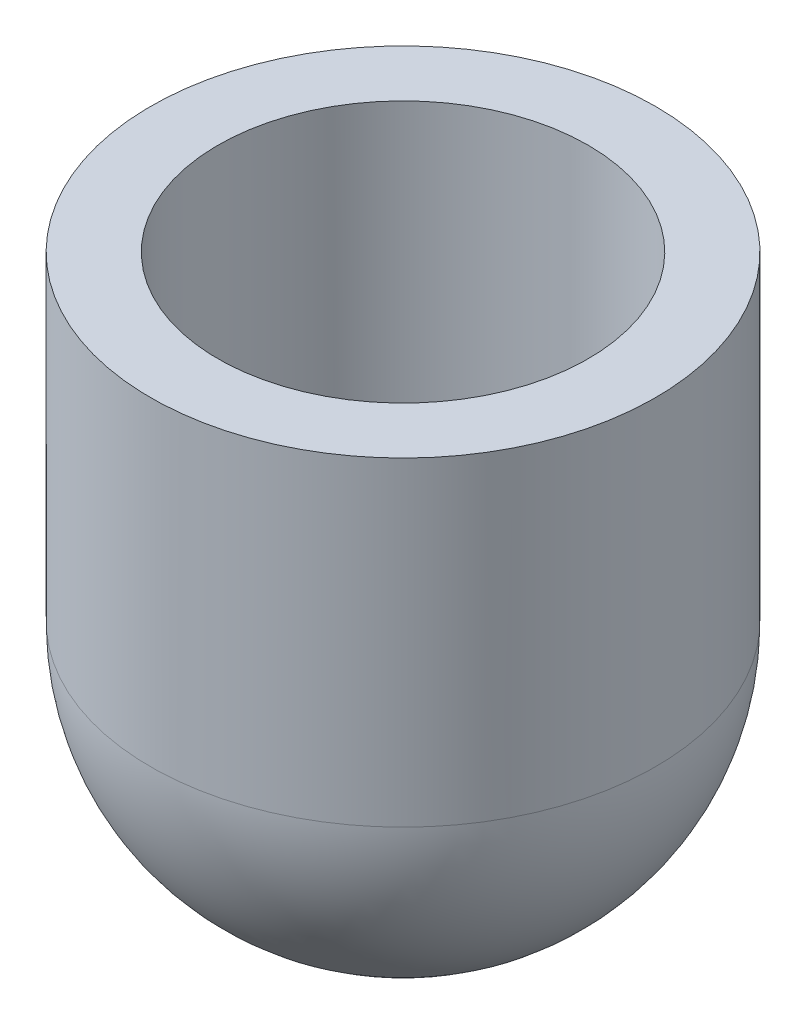
ISO-10303-21;
HEADER;
FILE_DESCRIPTION(('STEP AP214'),'2;1');
FILE_NAME('part.step','',(''),(''),'','','');
FILE_SCHEMA(('AUTOMOTIVE_DESIGN { 1 0 10303 214 1 1 1 1 }'));
ENDSEC;
DATA;
#1=APPLICATION_CONTEXT('core data for automotive mechanical design processes');
#2=APPLICATION_PROTOCOL_DEFINITION('international standard','automotive_design',2000,#1);
#3=PRODUCT_CONTEXT('',#1,'mechanical');
#4=PRODUCT('Part','Part','',(#3));
#5=PRODUCT_RELATED_PRODUCT_CATEGORY('part','',(#4));
#6=PRODUCT_DEFINITION_FORMATION('','',#4);
#7=PRODUCT_DEFINITION_CONTEXT('part definition',#1,'design');
#8=PRODUCT_DEFINITION('design','',#6,#7);
#9=PRODUCT_DEFINITION_SHAPE('','',#8);
#10=(LENGTH_UNIT() NAMED_UNIT(*) SI_UNIT(.MILLI.,.METRE.));
#11=(NAMED_UNIT(*) PLANE_ANGLE_UNIT() SI_UNIT($,.RADIAN.));
#12=(NAMED_UNIT(*) SI_UNIT($,.STERADIAN.) SOLID_ANGLE_UNIT());
#13=UNCERTAINTY_MEASURE_WITH_UNIT(LENGTH_MEASURE(1.E-05),#10,'distance_accuracy_value','');
#14=(GEOMETRIC_REPRESENTATION_CONTEXT(3) GLOBAL_UNCERTAINTY_ASSIGNED_CONTEXT((#13)) GLOBAL_UNIT_ASSIGNED_CONTEXT((#10,
#11,#12)) REPRESENTATION_CONTEXT('',''));
#15=CARTESIAN_POINT('',(0.,0.,0.));
#16=DIRECTION('',(0.,0.,1.));
#17=DIRECTION('',(1.,0.,0.));
#18=AXIS2_PLACEMENT_3D('',#15,#16,#17);
#19=CARTESIAN_POINT('',(-7.5,0.,0.));
#20=DIRECTION('',(0.,-1.,0.));
#21=DIRECTION('',(0.,0.,-1.));
#22=AXIS2_PLACEMENT_3D('',#19,#20,#21);
#23=PLANE('',#22);
#24=CARTESIAN_POINT('',(0.,0.,0.));
#25=DIRECTION('',(0.,-1.,0.));
#26=DIRECTION('',(0.,0.,-1.));
#27=AXIS2_PLACEMENT_3D('',#24,#25,#26);
#28=CIRCLE('',#27,7.5);
#29=CARTESIAN_POINT('',(0.,0.,-7.5));
#30=VERTEX_POINT('',#29);
#31=EDGE_CURVE('E10',#30,#30,#28,.T.);
#32=ORIENTED_EDGE('',*,*,#31,.F.);
#33=EDGE_LOOP('',(#32));
#34=FACE_BOUND('',#33,.T.);
#35=CARTESIAN_POINT('',(0.,0.,0.));
#36=DIRECTION('',(0.,-1.,0.));
#37=DIRECTION('',(0.,0.,-1.));
#38=AXIS2_PLACEMENT_3D('',#35,#36,#37);
#39=CIRCLE('',#38,5.5);
#40=CARTESIAN_POINT('',(0.,0.,-5.5));
#41=VERTEX_POINT('',#40);
#42=EDGE_CURVE('E51',#41,#41,#39,.T.);
#43=ORIENTED_EDGE('',*,*,#42,.T.);
#44=EDGE_LOOP('',(#43));
#45=FACE_BOUND('',#44,.T.);
#46=ADVANCED_FACE('F37',(#34,#45),#23,.F.);
#47=CARTESIAN_POINT('',(0.,-17.,0.));
#48=DIRECTION('',(0.,-1.,0.));
#49=DIRECTION('',(0.,0.,-1.));
#50=AXIS2_PLACEMENT_3D('',#47,#48,#49);
#51=CYLINDRICAL_SURFACE('',#50,7.5);
#52=CARTESIAN_POINT('',(0.,-9.5,0.));
#53=DIRECTION('',(0.,-1.,0.));
#54=DIRECTION('',(0.,0.,-1.));
#55=AXIS2_PLACEMENT_3D('',#52,#53,#54);
#56=CIRCLE('',#55,7.5);
#57=CARTESIAN_POINT('',(0.,-9.5,-7.5));
#58=VERTEX_POINT('',#57);
#59=EDGE_CURVE('E43',#58,#58,#56,.T.);
#60=ORIENTED_EDGE('',*,*,#59,.F.);
#61=EDGE_LOOP('',(#60));
#62=FACE_BOUND('',#61,.T.);
#63=ORIENTED_EDGE('',*,*,#31,.T.);
#64=EDGE_LOOP('',(#63));
#65=FACE_BOUND('',#64,.T.);
#66=ADVANCED_FACE('F71',(#62,#65),#51,.T.);
#67=CARTESIAN_POINT('',(0.,-9.5,0.));
#68=DIRECTION('',(0.,-1.,0.));
#69=DIRECTION('',(-1.,0.,0.));
#70=AXIS2_PLACEMENT_3D('',#67,#68,#69);
#71=SPHERICAL_SURFACE('',#70,7.5);
#72=ORIENTED_EDGE('',*,*,#59,.T.);
#73=EDGE_LOOP('',(#72));
#74=FACE_BOUND('',#73,.T.);
#75=ADVANCED_FACE('F66',(#74),#71,.T.);
#76=CARTESIAN_POINT('',(0.,-9.5,0.));
#77=DIRECTION('',(0.,-1.,0.));
#78=DIRECTION('',(-1.,0.,0.));
#79=AXIS2_PLACEMENT_3D('',#76,#77,#78);
#80=SPHERICAL_SURFACE('',#79,5.5);
#81=CARTESIAN_POINT('',(0.,-9.5,0.));
#82=DIRECTION('',(0.,-1.,0.));
#83=DIRECTION('',(0.,0.,-1.));
#84=AXIS2_PLACEMENT_3D('',#81,#82,#83);
#85=CIRCLE('',#84,5.5);
#86=CARTESIAN_POINT('',(0.,-9.5,-5.5));
#87=VERTEX_POINT('',#86);
#88=EDGE_CURVE('E47',#87,#87,#85,.T.);
#89=ORIENTED_EDGE('',*,*,#88,.F.);
#90=EDGE_LOOP('',(#89));
#91=FACE_BOUND('',#90,.T.);
#92=ADVANCED_FACE('F61',(#91),#80,.F.);
#93=CARTESIAN_POINT('',(0.,-17.,0.));
#94=DIRECTION('',(0.,-1.,0.));
#95=DIRECTION('',(0.,0.,-1.));
#96=AXIS2_PLACEMENT_3D('',#93,#94,#95);
#97=CYLINDRICAL_SURFACE('',#96,5.5);
#98=ORIENTED_EDGE('',*,*,#42,.F.);
#99=EDGE_LOOP('',(#98));
#100=FACE_BOUND('',#99,.T.);
#101=ORIENTED_EDGE('',*,*,#88,.T.);
#102=EDGE_LOOP('',(#101));
#103=FACE_BOUND('',#102,.T.);
#104=ADVANCED_FACE('F58',(#100,#103),#97,.F.);
#105=CLOSED_SHELL('',(#46,#66,#75,#92,#104));
#106=MANIFOLD_SOLID_BREP('B2',#105);
#107=ADVANCED_BREP_SHAPE_REPRESENTATION('',(#18,#106),#14);
#108=SHAPE_DEFINITION_REPRESENTATION(#9,#107);
ENDSEC;
END-ISO-10303-21;
